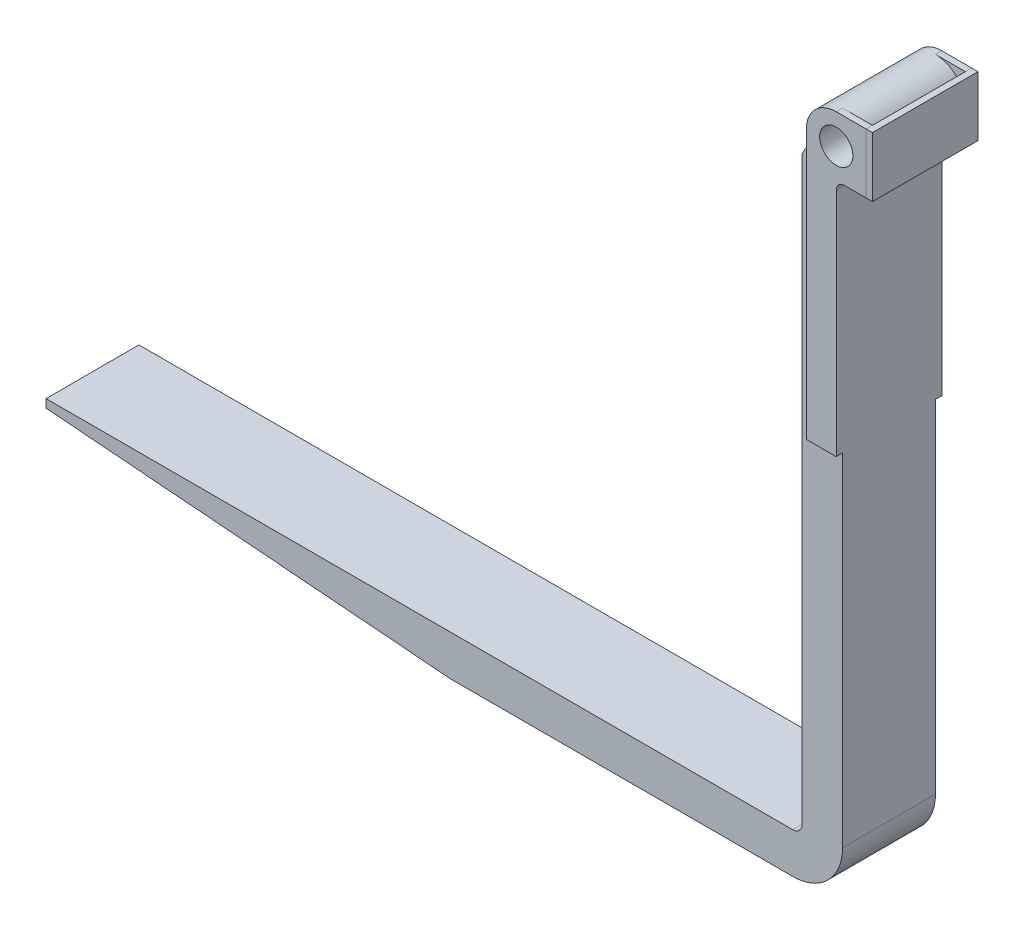
ISO-10303-21;
HEADER;
FILE_DESCRIPTION(('STEP AP214'),'2;1');
FILE_NAME('part.step','',(''),(''),'','','');
FILE_SCHEMA(('AUTOMOTIVE_DESIGN { 1 0 10303 214 1 1 1 1 }'));
ENDSEC;
DATA;
#1=APPLICATION_CONTEXT('core data for automotive mechanical design processes');
#2=APPLICATION_PROTOCOL_DEFINITION('international standard','automotive_design',2000,#1);
#3=PRODUCT_CONTEXT('',#1,'mechanical');
#4=PRODUCT('Part','Part','',(#3));
#5=PRODUCT_RELATED_PRODUCT_CATEGORY('part','',(#4));
#6=PRODUCT_DEFINITION_FORMATION('','',#4);
#7=PRODUCT_DEFINITION_CONTEXT('part definition',#1,'design');
#8=PRODUCT_DEFINITION('design','',#6,#7);
#9=PRODUCT_DEFINITION_SHAPE('','',#8);
#10=(LENGTH_UNIT() NAMED_UNIT(*) SI_UNIT(.MILLI.,.METRE.));
#11=(NAMED_UNIT(*) PLANE_ANGLE_UNIT() SI_UNIT($,.RADIAN.));
#12=(NAMED_UNIT(*) SI_UNIT($,.STERADIAN.) SOLID_ANGLE_UNIT());
#13=UNCERTAINTY_MEASURE_WITH_UNIT(LENGTH_MEASURE(1.E-05),#10,'distance_accuracy_value','');
#14=(GEOMETRIC_REPRESENTATION_CONTEXT(3) GLOBAL_UNCERTAINTY_ASSIGNED_CONTEXT((#13)) GLOBAL_UNIT_ASSIGNED_CONTEXT((#10,
#11,#12)) REPRESENTATION_CONTEXT('',''));
#15=CARTESIAN_POINT('',(0.,0.,0.));
#16=DIRECTION('',(0.,0.,1.));
#17=DIRECTION('',(1.,0.,0.));
#18=AXIS2_PLACEMENT_3D('',#15,#16,#17);
#19=CARTESIAN_POINT('',(54.5,1040.,79.5));
#20=DIRECTION('',(0.,0.,-1.));
#21=DIRECTION('',(-1.,0.,0.));
#22=AXIS2_PLACEMENT_3D('',#19,#20,#21);
#23=PLANE('',#22);
#24=DIRECTION('',(0.,-1.,0.));
#25=VECTOR('',#24,1.);
#26=CARTESIAN_POINT('',(45.,1040.,79.5));
#27=LINE('',#26,#25);
#28=CARTESIAN_POINT('',(45.,1040.,79.5));
#29=VERTEX_POINT('',#28);
#30=CARTESIAN_POINT('',(45.,950.,79.5));
#31=VERTEX_POINT('',#30);
#32=EDGE_CURVE('E106',#29,#31,#27,.T.);
#33=ORIENTED_EDGE('',*,*,#32,.T.);
#34=DIRECTION('',(-1.,0.,0.));
#35=VECTOR('',#34,1.);
#36=CARTESIAN_POINT('',(54.5,950.,79.5));
#37=LINE('',#36,#35);
#38=CARTESIAN_POINT('',(54.5,950.,79.5));
#39=VERTEX_POINT('',#38);
#40=EDGE_CURVE('E12',#39,#31,#37,.T.);
#41=ORIENTED_EDGE('',*,*,#40,.F.);
#42=DIRECTION('',(0.,-1.,0.));
#43=VECTOR('',#42,1.);
#44=CARTESIAN_POINT('',(54.5,1040.,79.5));
#45=LINE('',#44,#43);
#46=CARTESIAN_POINT('',(54.5,1040.,79.5));
#47=VERTEX_POINT('',#46);
#48=EDGE_CURVE('E94',#47,#39,#45,.T.);
#49=ORIENTED_EDGE('',*,*,#48,.F.);
#50=DIRECTION('',(-1.,0.,0.));
#51=VECTOR('',#50,1.);
#52=CARTESIAN_POINT('',(54.5,1040.,79.5));
#53=LINE('',#52,#51);
#54=EDGE_CURVE('E102',#47,#29,#53,.T.);
#55=ORIENTED_EDGE('',*,*,#54,.T.);
#56=EDGE_LOOP('',(#33,#41,#49,#55));
#57=FACE_BOUND('',#56,.T.);
#58=ADVANCED_FACE('F43',(#57),#23,.F.);
#59=CARTESIAN_POINT('',(54.5,950.,79.5));
#60=DIRECTION('',(0.,1.,0.));
#61=DIRECTION('',(0.,0.,1.));
#62=AXIS2_PLACEMENT_3D('',#59,#60,#61);
#63=PLANE('',#62);
#64=DIRECTION('',(0.,0.,-1.));
#65=VECTOR('',#64,1.);
#66=CARTESIAN_POINT('',(45.,950.,79.5));
#67=LINE('',#66,#65);
#68=CARTESIAN_POINT('',(45.,950.,-79.5));
#69=VERTEX_POINT('',#68);
#70=EDGE_CURVE('E98',#31,#69,#67,.T.);
#71=ORIENTED_EDGE('',*,*,#70,.T.);
#72=DIRECTION('',(-1.,0.,0.));
#73=VECTOR('',#72,1.);
#74=CARTESIAN_POINT('',(54.5,950.,-79.5));
#75=LINE('',#74,#73);
#76=CARTESIAN_POINT('',(54.5,950.,-79.5));
#77=VERTEX_POINT('',#76);
#78=EDGE_CURVE('E51',#77,#69,#75,.T.);
#79=ORIENTED_EDGE('',*,*,#78,.F.);
#80=DIRECTION('',(0.,0.,-1.));
#81=VECTOR('',#80,1.);
#82=CARTESIAN_POINT('',(54.5,950.,79.5));
#83=LINE('',#82,#81);
#84=EDGE_CURVE('E89',#39,#77,#83,.T.);
#85=ORIENTED_EDGE('',*,*,#84,.F.);
#86=ORIENTED_EDGE('',*,*,#40,.T.);
#87=EDGE_LOOP('',(#71,#79,#85,#86));
#88=FACE_BOUND('',#87,.T.);
#89=ADVANCED_FACE('F97',(#88),#63,.F.);
#90=CARTESIAN_POINT('',(54.5,1040.,-79.5));
#91=DIRECTION('',(0.,0.,1.));
#92=DIRECTION('',(1.,0.,0.));
#93=AXIS2_PLACEMENT_3D('',#90,#91,#92);
#94=PLANE('',#93);
#95=DIRECTION('',(0.,1.,0.));
#96=VECTOR('',#95,1.);
#97=CARTESIAN_POINT('',(45.,1040.,-79.5));
#98=LINE('',#97,#96);
#99=CARTESIAN_POINT('',(45.,1040.,-79.5));
#100=VERTEX_POINT('',#99);
#101=EDGE_CURVE('E76',#69,#100,#98,.T.);
#102=ORIENTED_EDGE('',*,*,#101,.T.);
#103=DIRECTION('',(-1.,0.,0.));
#104=VECTOR('',#103,1.);
#105=CARTESIAN_POINT('',(54.5,1040.,-79.5));
#106=LINE('',#105,#104);
#107=CARTESIAN_POINT('',(54.5,1040.,-79.5));
#108=VERTEX_POINT('',#107);
#109=EDGE_CURVE('E99',#108,#100,#106,.T.);
#110=ORIENTED_EDGE('',*,*,#109,.F.);
#111=DIRECTION('',(0.,1.,0.));
#112=VECTOR('',#111,1.);
#113=CARTESIAN_POINT('',(54.5,1040.,-79.5));
#114=LINE('',#113,#112);
#115=EDGE_CURVE('E92',#77,#108,#114,.T.);
#116=ORIENTED_EDGE('',*,*,#115,.F.);
#117=ORIENTED_EDGE('',*,*,#78,.T.);
#118=EDGE_LOOP('',(#102,#110,#116,#117));
#119=FACE_BOUND('',#118,.T.);
#120=ADVANCED_FACE('F100',(#119),#94,.F.);
#121=CARTESIAN_POINT('',(54.5,1040.,79.5));
#122=DIRECTION('',(0.,-1.,0.));
#123=DIRECTION('',(0.,0.,-1.));
#124=AXIS2_PLACEMENT_3D('',#121,#122,#123);
#125=PLANE('',#124);
#126=DIRECTION('',(0.,0.,1.));
#127=VECTOR('',#126,1.);
#128=CARTESIAN_POINT('',(45.,1040.,79.5));
#129=LINE('',#128,#127);
#130=EDGE_CURVE('E82',#100,#29,#129,.T.);
#131=ORIENTED_EDGE('',*,*,#130,.T.);
#132=ORIENTED_EDGE('',*,*,#54,.F.);
#133=DIRECTION('',(0.,0.,1.));
#134=VECTOR('',#133,1.);
#135=CARTESIAN_POINT('',(54.5,1040.,79.5));
#136=LINE('',#135,#134);
#137=EDGE_CURVE('E59',#108,#47,#136,.T.);
#138=ORIENTED_EDGE('',*,*,#137,.F.);
#139=ORIENTED_EDGE('',*,*,#109,.T.);
#140=EDGE_LOOP('',(#131,#132,#138,#139));
#141=FACE_BOUND('',#140,.T.);
#142=ADVANCED_FACE('F113',(#141),#125,.F.);
#143=CARTESIAN_POINT('',(54.5,0.,0.));
#144=DIRECTION('',(1.,0.,0.));
#145=DIRECTION('',(0.,0.,-1.));
#146=AXIS2_PLACEMENT_3D('',#143,#144,#145);
#147=PLANE('',#146);
#148=ORIENTED_EDGE('',*,*,#48,.T.);
#149=ORIENTED_EDGE('',*,*,#84,.T.);
#150=ORIENTED_EDGE('',*,*,#115,.T.);
#151=ORIENTED_EDGE('',*,*,#137,.T.);
#152=EDGE_LOOP('',(#148,#149,#150,#151));
#153=FACE_BOUND('',#152,.T.);
#154=ADVANCED_FACE('F90',(#153),#147,.T.);
#155=CARTESIAN_POINT('',(45.,0.,0.));
#156=DIRECTION('',(1.,0.,0.));
#157=DIRECTION('',(0.,0.,-1.));
#158=AXIS2_PLACEMENT_3D('',#155,#156,#157);
#159=PLANE('',#158);
#160=ORIENTED_EDGE('',*,*,#32,.F.);
#161=ORIENTED_EDGE('',*,*,#130,.F.);
#162=ORIENTED_EDGE('',*,*,#101,.F.);
#163=ORIENTED_EDGE('',*,*,#70,.F.);
#164=EDGE_LOOP('',(#160,#161,#162,#163));
#165=FACE_BOUND('',#164,.T.);
#166=ADVANCED_FACE('F116',(#165),#159,.F.);
#167=CLOSED_SHELL('',(#58,#89,#120,#142,#154,#166));
#168=MANIFOLD_SOLID_BREP('B2',#167);
#169=CARTESIAN_POINT('',(-75.,75.,-70.));
#170=DIRECTION('',(0.,0.,-1.));
#171=DIRECTION('',(-1.,0.,0.));
#172=AXIS2_PLACEMENT_3D('',#169,#170,#171);
#173=PLANE('',#172);
#174=DIRECTION('',(-0.489295003783335,-0.87211834017676,0.));
#175=VECTOR('',#174,1.);
#176=CARTESIAN_POINT('',(-61.,950.,-70.));
#177=LINE('',#176,#175);
#178=CARTESIAN_POINT('',(-45.,978.518364861553,-70.));
#179=VERTEX_POINT('',#178);
#180=CARTESIAN_POINT('',(-61.,950.,-70.));
#181=VERTEX_POINT('',#180);
#182=EDGE_CURVE('E433',#179,#181,#177,.T.);
#183=ORIENTED_EDGE('',*,*,#182,.F.);
#184=DIRECTION('',(0.,-1.,0.));
#185=VECTOR('',#184,1.);
#186=CARTESIAN_POINT('',(-45.0000000000001,0.,-70.));
#187=LINE('',#186,#185);
#188=CARTESIAN_POINT('',(-45.0000000000001,590.,-70.));
#189=VERTEX_POINT('',#188);
#190=EDGE_CURVE('E41',#179,#189,#187,.T.);
#191=ORIENTED_EDGE('',*,*,#190,.T.);
#192=DIRECTION('',(1.,0.,0.));
#193=VECTOR('',#192,1.);
#194=CARTESIAN_POINT('',(1.45562574339743E-12,590.,-70.));
#195=LINE('',#194,#193);
#196=CARTESIAN_POINT('',(0.,590.,-70.));
#197=VERTEX_POINT('',#196);
#198=EDGE_CURVE('E413',#189,#197,#195,.T.);
#199=ORIENTED_EDGE('',*,*,#198,.T.);
#200=DIRECTION('',(0.,-1.,0.));
#201=VECTOR('',#200,1.);
#202=CARTESIAN_POINT('',(0.,950.,-70.));
#203=LINE('',#202,#201);
#204=CARTESIAN_POINT('',(0.,75.0000000000005,-70.));
#205=VERTEX_POINT('',#204);
#206=EDGE_CURVE('E547',#197,#205,#203,.T.);
#207=ORIENTED_EDGE('',*,*,#206,.T.);
#208=CARTESIAN_POINT('',(-75.,75.,-70.));
#209=DIRECTION('',(0.,0.,-1.));
#210=DIRECTION('',(-1.,0.,0.));
#211=AXIS2_PLACEMENT_3D('',#208,#209,#210);
#212=CIRCLE('',#211,75.);
#213=CARTESIAN_POINT('',(-75.0000000000005,0.,-70.));
#214=VERTEX_POINT('',#213);
#215=EDGE_CURVE('E544',#205,#214,#212,.T.);
#216=ORIENTED_EDGE('',*,*,#215,.T.);
#217=DIRECTION('',(-1.,0.,0.));
#218=VECTOR('',#217,1.);
#219=CARTESIAN_POINT('',(-75.0000000000005,0.,-70.));
#220=LINE('',#219,#218);
#221=CARTESIAN_POINT('',(-590.,0.,-69.9999999999998));
#222=VERTEX_POINT('',#221);
#223=EDGE_CURVE('E542',#214,#222,#220,.T.);
#224=ORIENTED_EDGE('',*,*,#223,.T.);
#225=DIRECTION('',(0.996854130580606,-0.0792580743166547,0.));
#226=VECTOR('',#225,1.);
#227=CARTESIAN_POINT('',(-84.1608042146896,-40.2183622878485,-70.));
#228=LINE('',#227,#226);
#229=CARTESIAN_POINT('',(-1200.,48.5,-70.));
#230=VERTEX_POINT('',#229);
#231=EDGE_CURVE('E171',#230,#222,#228,.T.);
#232=ORIENTED_EDGE('',*,*,#231,.F.);
#233=DIRECTION('',(0.,1.,0.));
#234=VECTOR('',#233,1.);
#235=CARTESIAN_POINT('',(-1200.,-1.46957615897682E-13,-70.));
#236=LINE('',#235,#234);
#237=CARTESIAN_POINT('',(-1200.,60.9999999999998,-70.));
#238=VERTEX_POINT('',#237);
#239=EDGE_CURVE('E540',#230,#238,#236,.T.);
#240=ORIENTED_EDGE('',*,*,#239,.T.);
#241=DIRECTION('',(-1.,0.,0.));
#242=VECTOR('',#241,1.);
#243=CARTESIAN_POINT('',(-75.0000000000005,61.,-70.));
#244=LINE('',#243,#242);
#245=CARTESIAN_POINT('',(-75.0000000000005,61.,-70.));
#246=VERTEX_POINT('',#245);
#247=EDGE_CURVE('E517',#246,#238,#244,.T.);
#248=ORIENTED_EDGE('',*,*,#247,.F.);
#249=CARTESIAN_POINT('',(-75.,75.,-70.));
#250=DIRECTION('',(0.,0.,1.));
#251=DIRECTION('',(1.,0.,0.));
#252=AXIS2_PLACEMENT_3D('',#249,#250,#251);
#253=CIRCLE('',#252,14.);
#254=CARTESIAN_POINT('',(-61.,75.0000000000001,-70.));
#255=VERTEX_POINT('',#254);
#256=EDGE_CURVE('E522',#255,#246,#253,.F.);
#257=ORIENTED_EDGE('',*,*,#256,.F.);
#258=DIRECTION('',(0.,1.,0.));
#259=VECTOR('',#258,1.);
#260=CARTESIAN_POINT('',(-61.,950.,-70.));
#261=LINE('',#260,#259);
#262=EDGE_CURVE('E550',#181,#255,#261,.F.);
#263=ORIENTED_EDGE('',*,*,#262,.F.);
#264=EDGE_LOOP('',(#183,#191,#199,#207,#216,#224,#232,#240,#248,#257,#263));
#265=FACE_BOUND('',#264,.T.);
#266=ADVANCED_FACE('F167',(#265),#173,.T.);
#267=CARTESIAN_POINT('',(0.,0.,70.));
#268=DIRECTION('',(0.,0.,1.));
#269=DIRECTION('',(1.,0.,0.));
#270=AXIS2_PLACEMENT_3D('',#267,#268,#269);
#271=PLANE('',#270);
#272=CARTESIAN_POINT('',(0.,995.,70.));
#273=DIRECTION('',(0.,0.,1.));
#274=DIRECTION('',(1.,0.,0.));
#275=AXIS2_PLACEMENT_3D('',#272,#273,#274);
#276=CIRCLE('',#275,45.);
#277=CARTESIAN_POINT('',(-45.,995.,70.));
#278=VERTEX_POINT('',#277);
#279=CARTESIAN_POINT('',(-43.0691824984959,981.959849735863,70.));
#280=VERTEX_POINT('',#279);
#281=EDGE_CURVE('E434',#278,#280,#276,.T.);
#282=ORIENTED_EDGE('',*,*,#281,.T.);
#283=DIRECTION('',(-0.489295003783335,-0.87211834017676,0.));
#284=VECTOR('',#283,1.);
#285=CARTESIAN_POINT('',(-61.,950.,70.));
#286=LINE('',#285,#284);
#287=CARTESIAN_POINT('',(-45.,978.518364861553,70.));
#288=VERTEX_POINT('',#287);
#289=EDGE_CURVE('E439',#280,#288,#286,.T.);
#290=ORIENTED_EDGE('',*,*,#289,.T.);
#291=DIRECTION('',(0.,-1.,0.));
#292=VECTOR('',#291,1.);
#293=CARTESIAN_POINT('',(-45.0000000000001,0.,70.));
#294=LINE('',#293,#292);
#295=EDGE_CURVE('E478',#278,#288,#294,.T.);
#296=ORIENTED_EDGE('',*,*,#295,.F.);
#297=EDGE_LOOP('',(#282,#290,#296));
#298=FACE_BOUND('',#297,.T.);
#299=ADVANCED_FACE('F599',(#298),#271,.F.);
#300=CARTESIAN_POINT('',(0.,950.,70.));
#301=VERTEX_POINT('',#300);
#302=CARTESIAN_POINT('',(45.,995.,70.));
#303=VERTEX_POINT('',#302);
#304=EDGE_CURVE('E193',#301,#303,#276,.T.);
#305=ORIENTED_EDGE('',*,*,#304,.T.);
#306=DIRECTION('',(0.,1.,0.));
#307=VECTOR('',#306,1.);
#308=CARTESIAN_POINT('',(45.,0.,70.));
#309=LINE('',#308,#307);
#310=CARTESIAN_POINT('',(45.,950.,70.));
#311=VERTEX_POINT('',#310);
#312=EDGE_CURVE('E472',#311,#303,#309,.T.);
#313=ORIENTED_EDGE('',*,*,#312,.F.);
#314=DIRECTION('',(1.,0.,0.));
#315=VECTOR('',#314,1.);
#316=CARTESIAN_POINT('',(0.,950.,70.));
#317=LINE('',#316,#315);
#318=CARTESIAN_POINT('',(12.5000000000001,950.,70.));
#319=VERTEX_POINT('',#318);
#320=EDGE_CURVE('E454',#319,#311,#317,.T.);
#321=ORIENTED_EDGE('',*,*,#320,.F.);
#322=CARTESIAN_POINT('',(12.5,937.5,70.));
#323=DIRECTION('',(0.,0.,1.));
#324=DIRECTION('',(1.,0.,0.));
#325=AXIS2_PLACEMENT_3D('',#322,#323,#324);
#326=CIRCLE('',#325,12.5);
#327=CARTESIAN_POINT('',(0.,937.5,70.));
#328=VERTEX_POINT('',#327);
#329=EDGE_CURVE('E484',#328,#319,#326,.F.);
#330=ORIENTED_EDGE('',*,*,#329,.F.);
#331=DIRECTION('',(0.,-1.,0.));
#332=VECTOR('',#331,1.);
#333=CARTESIAN_POINT('',(0.,950.,70.));
#334=LINE('',#333,#332);
#335=EDGE_CURVE('E531',#301,#328,#334,.T.);
#336=ORIENTED_EDGE('',*,*,#335,.F.);
#337=EDGE_LOOP('',(#305,#313,#321,#330,#336));
#338=FACE_BOUND('',#337,.T.);
#339=ADVANCED_FACE('F658',(#338),#271,.F.);
#340=CARTESIAN_POINT('',(0.,1040.,70.));
#341=VERTEX_POINT('',#340);
#342=EDGE_CURVE('E431',#303,#341,#276,.T.);
#343=ORIENTED_EDGE('',*,*,#342,.T.);
#344=DIRECTION('',(-1.,0.,0.));
#345=VECTOR('',#344,1.);
#346=CARTESIAN_POINT('',(0.,1040.,70.));
#347=LINE('',#346,#345);
#348=CARTESIAN_POINT('',(45.,1040.,70.));
#349=VERTEX_POINT('',#348);
#350=EDGE_CURVE('E475',#349,#341,#347,.T.);
#351=ORIENTED_EDGE('',*,*,#350,.F.);
#352=EDGE_CURVE('E449',#303,#349,#309,.T.);
#353=ORIENTED_EDGE('',*,*,#352,.F.);
#354=EDGE_LOOP('',(#343,#351,#353));
#355=FACE_BOUND('',#354,.T.);
#356=ADVANCED_FACE('F657',(#355),#271,.F.);
#357=CARTESIAN_POINT('',(-75.,75.,70.));
#358=DIRECTION('',(0.,0.,-1.));
#359=DIRECTION('',(-1.,0.,0.));
#360=AXIS2_PLACEMENT_3D('',#357,#358,#359);
#361=PLANE('',#360);
#362=DIRECTION('',(1.,0.,0.));
#363=VECTOR('',#362,1.);
#364=CARTESIAN_POINT('',(1.45562574339743E-12,590.,70.));
#365=LINE('',#364,#363);
#366=CARTESIAN_POINT('',(-45.0000000000001,590.,70.));
#367=VERTEX_POINT('',#366);
#368=CARTESIAN_POINT('',(0.,590.,70.));
#369=VERTEX_POINT('',#368);
#370=EDGE_CURVE('E481',#367,#369,#365,.T.);
#371=ORIENTED_EDGE('',*,*,#370,.F.);
#372=EDGE_CURVE('E176',#288,#367,#294,.T.);
#373=ORIENTED_EDGE('',*,*,#372,.F.);
#374=CARTESIAN_POINT('',(-61.,950.,70.));
#375=VERTEX_POINT('',#374);
#376=EDGE_CURVE('E443',#288,#375,#286,.T.);
#377=ORIENTED_EDGE('',*,*,#376,.T.);
#378=DIRECTION('',(0.,1.,0.));
#379=VECTOR('',#378,1.);
#380=CARTESIAN_POINT('',(-61.,950.,70.));
#381=LINE('',#380,#379);
#382=CARTESIAN_POINT('',(-61.,75.0000000000001,70.));
#383=VERTEX_POINT('',#382);
#384=EDGE_CURVE('E533',#375,#383,#381,.F.);
#385=ORIENTED_EDGE('',*,*,#384,.T.);
#386=CARTESIAN_POINT('',(-75.,75.,70.));
#387=DIRECTION('',(0.,0.,1.));
#388=DIRECTION('',(1.,0.,0.));
#389=AXIS2_PLACEMENT_3D('',#386,#387,#388);
#390=CIRCLE('',#389,14.);
#391=CARTESIAN_POINT('',(-75.0000000000005,61.,70.));
#392=VERTEX_POINT('',#391);
#393=EDGE_CURVE('E535',#383,#392,#390,.F.);
#394=ORIENTED_EDGE('',*,*,#393,.T.);
#395=DIRECTION('',(-1.,0.,0.));
#396=VECTOR('',#395,1.);
#397=CARTESIAN_POINT('',(-75.0000000000005,61.,70.));
#398=LINE('',#397,#396);
#399=CARTESIAN_POINT('',(-1200.,60.9999999999998,70.));
#400=VERTEX_POINT('',#399);
#401=EDGE_CURVE('E518',#392,#400,#398,.T.);
#402=ORIENTED_EDGE('',*,*,#401,.T.);
#403=DIRECTION('',(0.,1.,0.));
#404=VECTOR('',#403,1.);
#405=CARTESIAN_POINT('',(-1200.,-1.46957615897682E-13,70.));
#406=LINE('',#405,#404);
#407=CARTESIAN_POINT('',(-1200.,48.5,70.));
#408=VERTEX_POINT('',#407);
#409=EDGE_CURVE('E521',#408,#400,#406,.T.);
#410=ORIENTED_EDGE('',*,*,#409,.F.);
#411=DIRECTION('',(0.996854130580606,-0.0792580743166547,0.));
#412=VECTOR('',#411,1.);
#413=CARTESIAN_POINT('',(-84.1608042146896,-40.2183622878485,70.));
#414=LINE('',#413,#412);
#415=CARTESIAN_POINT('',(-589.999999999999,0.,70.));
#416=VERTEX_POINT('',#415);
#417=EDGE_CURVE('E513',#408,#416,#414,.T.);
#418=ORIENTED_EDGE('',*,*,#417,.T.);
#419=DIRECTION('',(-1.,0.,0.));
#420=VECTOR('',#419,1.);
#421=CARTESIAN_POINT('',(-75.0000000000005,0.,70.));
#422=LINE('',#421,#420);
#423=CARTESIAN_POINT('',(-75.0000000000005,0.,70.));
#424=VERTEX_POINT('',#423);
#425=EDGE_CURVE('E524',#424,#416,#422,.T.);
#426=ORIENTED_EDGE('',*,*,#425,.F.);
#427=CARTESIAN_POINT('',(-75.,75.,70.));
#428=DIRECTION('',(0.,0.,-1.));
#429=DIRECTION('',(-1.,0.,0.));
#430=AXIS2_PLACEMENT_3D('',#427,#428,#429);
#431=CIRCLE('',#430,75.);
#432=CARTESIAN_POINT('',(0.,75.0000000000005,70.));
#433=VERTEX_POINT('',#432);
#434=EDGE_CURVE('E527',#433,#424,#431,.T.);
#435=ORIENTED_EDGE('',*,*,#434,.F.);
#436=EDGE_CURVE('E530',#369,#433,#334,.T.);
#437=ORIENTED_EDGE('',*,*,#436,.F.);
#438=EDGE_LOOP('',(#371,#373,#377,#385,#394,#402,#410,#418,#426,#435,#437));
#439=FACE_BOUND('',#438,.T.);
#440=ADVANCED_FACE('F607',(#439),#361,.F.);
#441=CARTESIAN_POINT('',(-75.0000000000005,0.,70.));
#442=DIRECTION('',(0.,-1.,0.));
#443=DIRECTION('',(1.,0.,0.));
#444=AXIS2_PLACEMENT_3D('',#441,#442,#443);
#445=PLANE('',#444);
#446=ORIENTED_EDGE('',*,*,#425,.T.);
#447=DIRECTION('',(0.,0.,-1.));
#448=VECTOR('',#447,1.);
#449=CARTESIAN_POINT('',(-590.,0.,2166.14061172003));
#450=LINE('',#449,#448);
#451=EDGE_CURVE('E510',#416,#222,#450,.T.);
#452=ORIENTED_EDGE('',*,*,#451,.T.);
#453=ORIENTED_EDGE('',*,*,#223,.F.);
#454=DIRECTION('',(0.,0.,-1.));
#455=VECTOR('',#454,1.);
#456=CARTESIAN_POINT('',(-75.0000000000005,0.,70.));
#457=LINE('',#456,#455);
#458=EDGE_CURVE('E567',#424,#214,#457,.T.);
#459=ORIENTED_EDGE('',*,*,#458,.F.);
#460=EDGE_LOOP('',(#446,#452,#453,#459));
#461=FACE_BOUND('',#460,.T.);
#462=ADVANCED_FACE('F626',(#461),#445,.T.);
#463=CARTESIAN_POINT('',(-75.0000000000005,61.,70.));
#464=DIRECTION('',(0.,-1.,0.));
#465=DIRECTION('',(1.,0.,0.));
#466=AXIS2_PLACEMENT_3D('',#463,#464,#465);
#467=PLANE('',#466);
#468=ORIENTED_EDGE('',*,*,#247,.T.);
#469=DIRECTION('',(0.,0.,-1.));
#470=VECTOR('',#469,1.);
#471=CARTESIAN_POINT('',(-1200.,60.9999999999998,70.));
#472=LINE('',#471,#470);
#473=EDGE_CURVE('E568',#400,#238,#472,.T.);
#474=ORIENTED_EDGE('',*,*,#473,.F.);
#475=ORIENTED_EDGE('',*,*,#401,.F.);
#476=DIRECTION('',(0.,0.,-1.));
#477=VECTOR('',#476,1.);
#478=CARTESIAN_POINT('',(-75.0000000000005,61.,70.));
#479=LINE('',#478,#477);
#480=EDGE_CURVE('E537',#392,#246,#479,.T.);
#481=ORIENTED_EDGE('',*,*,#480,.T.);
#482=EDGE_LOOP('',(#468,#474,#475,#481));
#483=FACE_BOUND('',#482,.T.);
#484=ADVANCED_FACE('F169',(#483),#467,.F.);
#485=CARTESIAN_POINT('',(-1200.,-1.46957615897682E-13,70.));
#486=DIRECTION('',(-1.,0.,0.));
#487=DIRECTION('',(0.,-1.,0.));
#488=AXIS2_PLACEMENT_3D('',#485,#486,#487);
#489=PLANE('',#488);
#490=DIRECTION('',(0.,0.,-1.));
#491=VECTOR('',#490,1.);
#492=CARTESIAN_POINT('',(-1200.,48.5,2166.14061172003));
#493=LINE('',#492,#491);
#494=EDGE_CURVE('E509',#408,#230,#493,.T.);
#495=ORIENTED_EDGE('',*,*,#494,.F.);
#496=ORIENTED_EDGE('',*,*,#409,.T.);
#497=ORIENTED_EDGE('',*,*,#473,.T.);
#498=ORIENTED_EDGE('',*,*,#239,.F.);
#499=EDGE_LOOP('',(#495,#496,#497,#498));
#500=FACE_BOUND('',#499,.T.);
#501=ADVANCED_FACE('F706',(#500),#489,.T.);
#502=CARTESIAN_POINT('',(-75.,75.,70.));
#503=DIRECTION('',(0.,0.,-1.));
#504=DIRECTION('',(-1.,0.,0.));
#505=AXIS2_PLACEMENT_3D('',#502,#503,#504);
#506=CYLINDRICAL_SURFACE('',#505,75.);
#507=ORIENTED_EDGE('',*,*,#215,.F.);
#508=DIRECTION('',(0.,0.,-1.));
#509=VECTOR('',#508,1.);
#510=CARTESIAN_POINT('',(0.,75.0000000000005,70.));
#511=LINE('',#510,#509);
#512=EDGE_CURVE('E564',#433,#205,#511,.T.);
#513=ORIENTED_EDGE('',*,*,#512,.F.);
#514=ORIENTED_EDGE('',*,*,#434,.T.);
#515=ORIENTED_EDGE('',*,*,#458,.T.);
#516=EDGE_LOOP('',(#507,#513,#514,#515));
#517=FACE_BOUND('',#516,.T.);
#518=ADVANCED_FACE('F631',(#517),#506,.T.);
#519=CARTESIAN_POINT('',(0.,950.,70.));
#520=DIRECTION('',(1.,0.,0.));
#521=DIRECTION('',(0.,0.,-1.));
#522=AXIS2_PLACEMENT_3D('',#519,#520,#521);
#523=PLANE('',#522);
#524=CARTESIAN_POINT('',(0.,950.,-70.));
#525=VERTEX_POINT('',#524);
#526=CARTESIAN_POINT('',(0.,937.5,-70.));
#527=VERTEX_POINT('',#526);
#528=EDGE_CURVE('E548',#525,#527,#203,.T.);
#529=ORIENTED_EDGE('',*,*,#528,.F.);
#530=DIRECTION('',(0.,0.,-1.));
#531=VECTOR('',#530,1.);
#532=CARTESIAN_POINT('',(0.,950.,70.));
#533=LINE('',#532,#531);
#534=EDGE_CURVE('E561',#301,#525,#533,.T.);
#535=ORIENTED_EDGE('',*,*,#534,.F.);
#536=ORIENTED_EDGE('',*,*,#335,.T.);
#537=DIRECTION('',(0.,0.,-1.));
#538=VECTOR('',#537,1.);
#539=CARTESIAN_POINT('',(0.,937.5,79.5));
#540=LINE('',#539,#538);
#541=CARTESIAN_POINT('',(0.,937.5,79.5));
#542=VERTEX_POINT('',#541);
#543=EDGE_CURVE('E492',#542,#328,#540,.T.);
#544=ORIENTED_EDGE('',*,*,#543,.F.);
#545=DIRECTION('',(0.,1.,0.));
#546=VECTOR('',#545,1.);
#547=CARTESIAN_POINT('',(0.,0.,79.5));
#548=LINE('',#547,#546);
#549=CARTESIAN_POINT('',(0.,590.,79.5));
#550=VERTEX_POINT('',#549);
#551=EDGE_CURVE('E462',#550,#542,#548,.T.);
#552=ORIENTED_EDGE('',*,*,#551,.F.);
#553=DIRECTION('',(0.,0.,-1.));
#554=VECTOR('',#553,1.);
#555=CARTESIAN_POINT('',(0.,590.,79.5));
#556=LINE('',#555,#554);
#557=EDGE_CURVE('E495',#550,#369,#556,.T.);
#558=ORIENTED_EDGE('',*,*,#557,.T.);
#559=ORIENTED_EDGE('',*,*,#436,.T.);
#560=ORIENTED_EDGE('',*,*,#512,.T.);
#561=ORIENTED_EDGE('',*,*,#206,.F.);
#562=DIRECTION('',(0.,0.,1.));
#563=VECTOR('',#562,1.);
#564=CARTESIAN_POINT('',(0.,590.,-79.5));
#565=LINE('',#564,#563);
#566=CARTESIAN_POINT('',(0.,590.,-79.5));
#567=VERTEX_POINT('',#566);
#568=EDGE_CURVE('E185',#567,#197,#565,.T.);
#569=ORIENTED_EDGE('',*,*,#568,.F.);
#570=DIRECTION('',(0.,1.,0.));
#571=VECTOR('',#570,1.);
#572=CARTESIAN_POINT('',(0.,0.,-79.5));
#573=LINE('',#572,#571);
#574=CARTESIAN_POINT('',(0.,937.5,-79.5));
#575=VERTEX_POINT('',#574);
#576=EDGE_CURVE('E388',#567,#575,#573,.T.);
#577=ORIENTED_EDGE('',*,*,#576,.T.);
#578=DIRECTION('',(0.,0.,1.));
#579=VECTOR('',#578,1.);
#580=CARTESIAN_POINT('',(0.,937.5,-79.5));
#581=LINE('',#580,#579);
#582=EDGE_CURVE('E427',#575,#527,#581,.T.);
#583=ORIENTED_EDGE('',*,*,#582,.T.);
#584=EDGE_LOOP('',(#529,#535,#536,#544,#552,#558,#559,#560,#561,#569,#577,#583));
#585=FACE_BOUND('',#584,.T.);
#586=ADVANCED_FACE('F635',(#585),#523,.T.);
#587=CARTESIAN_POINT('',(-61.,950.,70.));
#588=DIRECTION('',(1.,0.,0.));
#589=DIRECTION('',(0.,0.,-1.));
#590=AXIS2_PLACEMENT_3D('',#587,#588,#589);
#591=PLANE('',#590);
#592=ORIENTED_EDGE('',*,*,#262,.T.);
#593=DIRECTION('',(0.,0.,-1.));
#594=VECTOR('',#593,1.);
#595=CARTESIAN_POINT('',(-61.,75.0000000000001,70.));
#596=LINE('',#595,#594);
#597=EDGE_CURVE('E555',#383,#255,#596,.T.);
#598=ORIENTED_EDGE('',*,*,#597,.F.);
#599=ORIENTED_EDGE('',*,*,#384,.F.);
#600=DIRECTION('',(0.,0.,-1.));
#601=VECTOR('',#600,1.);
#602=CARTESIAN_POINT('',(-61.,950.,70.));
#603=LINE('',#602,#601);
#604=EDGE_CURVE('E558',#375,#181,#603,.T.);
#605=ORIENTED_EDGE('',*,*,#604,.T.);
#606=EDGE_LOOP('',(#592,#598,#599,#605));
#607=FACE_BOUND('',#606,.T.);
#608=ADVANCED_FACE('F612',(#607),#591,.F.);
#609=CARTESIAN_POINT('',(-75.,75.,70.));
#610=DIRECTION('',(0.,0.,-1.));
#611=DIRECTION('',(-1.,0.,0.));
#612=AXIS2_PLACEMENT_3D('',#609,#610,#611);
#613=CYLINDRICAL_SURFACE('',#612,14.);
#614=ORIENTED_EDGE('',*,*,#256,.T.);
#615=ORIENTED_EDGE('',*,*,#480,.F.);
#616=ORIENTED_EDGE('',*,*,#393,.F.);
#617=ORIENTED_EDGE('',*,*,#597,.T.);
#618=EDGE_LOOP('',(#614,#615,#616,#617));
#619=FACE_BOUND('',#618,.T.);
#620=ADVANCED_FACE('F616',(#619),#613,.F.);
#621=CARTESIAN_POINT('',(-1200.,48.5,2166.14061172003));
#622=DIRECTION('',(0.0792580743166547,0.996854130580606,0.));
#623=DIRECTION('',(-0.996854130580606,0.0792580743166547,0.));
#624=AXIS2_PLACEMENT_3D('',#621,#622,#623);
#625=PLANE('',#624);
#626=ORIENTED_EDGE('',*,*,#417,.F.);
#627=ORIENTED_EDGE('',*,*,#494,.T.);
#628=ORIENTED_EDGE('',*,*,#231,.T.);
#629=ORIENTED_EDGE('',*,*,#451,.F.);
#630=EDGE_LOOP('',(#626,#627,#628,#629));
#631=FACE_BOUND('',#630,.T.);
#632=ADVANCED_FACE('F623',(#631),#625,.F.);
#633=CARTESIAN_POINT('',(45.,0.,79.5));
#634=DIRECTION('',(-1.,0.,0.));
#635=DIRECTION('',(0.,0.,1.));
#636=AXIS2_PLACEMENT_3D('',#633,#634,#635);
#637=PLANE('',#636);
#638=ORIENTED_EDGE('',*,*,#312,.T.);
#639=ORIENTED_EDGE('',*,*,#352,.T.);
#640=DIRECTION('',(0.,0.,-1.));
#641=VECTOR('',#640,1.);
#642=CARTESIAN_POINT('',(45.,1040.,79.5));
#643=LINE('',#642,#641);
#644=CARTESIAN_POINT('',(45.,1040.,79.5));
#645=VERTEX_POINT('',#644);
#646=EDGE_CURVE('E506',#645,#349,#643,.T.);
#647=ORIENTED_EDGE('',*,*,#646,.F.);
#648=DIRECTION('',(0.,1.,0.));
#649=VECTOR('',#648,1.);
#650=CARTESIAN_POINT('',(45.,0.,79.5));
#651=LINE('',#650,#649);
#652=CARTESIAN_POINT('',(45.,950.,79.5));
#653=VERTEX_POINT('',#652);
#654=EDGE_CURVE('E450',#653,#645,#651,.T.);
#655=ORIENTED_EDGE('',*,*,#654,.F.);
#656=DIRECTION('',(0.,0.,-1.));
#657=VECTOR('',#656,1.);
#658=CARTESIAN_POINT('',(45.,950.,79.5));
#659=LINE('',#658,#657);
#660=EDGE_CURVE('E471',#653,#311,#659,.T.);
#661=ORIENTED_EDGE('',*,*,#660,.T.);
#662=EDGE_LOOP('',(#638,#639,#647,#655,#661));
#663=FACE_BOUND('',#662,.T.);
#664=ADVANCED_FACE('F650',(#663),#637,.F.);
#665=CARTESIAN_POINT('',(0.,1040.,79.5));
#666=DIRECTION('',(0.,-1.,0.));
#667=DIRECTION('',(0.,0.,-1.));
#668=AXIS2_PLACEMENT_3D('',#665,#666,#667);
#669=PLANE('',#668);
#670=ORIENTED_EDGE('',*,*,#350,.T.);
#671=DIRECTION('',(0.,0.,-1.));
#672=VECTOR('',#671,1.);
#673=CARTESIAN_POINT('',(0.,1040.,79.5));
#674=LINE('',#673,#672);
#675=CARTESIAN_POINT('',(0.,1040.,79.5));
#676=VERTEX_POINT('',#675);
#677=EDGE_CURVE('E503',#676,#341,#674,.T.);
#678=ORIENTED_EDGE('',*,*,#677,.F.);
#679=DIRECTION('',(-1.,0.,0.));
#680=VECTOR('',#679,1.);
#681=CARTESIAN_POINT('',(0.,1040.,79.5));
#682=LINE('',#681,#680);
#683=EDGE_CURVE('E453',#645,#676,#682,.T.);
#684=ORIENTED_EDGE('',*,*,#683,.F.);
#685=ORIENTED_EDGE('',*,*,#646,.T.);
#686=EDGE_LOOP('',(#670,#678,#684,#685));
#687=FACE_BOUND('',#686,.T.);
#688=ADVANCED_FACE('F653',(#687),#669,.F.);
#689=CARTESIAN_POINT('',(0.,995.,79.5));
#690=DIRECTION('',(0.,0.,-1.));
#691=DIRECTION('',(-1.,0.,0.));
#692=AXIS2_PLACEMENT_3D('',#689,#690,#691);
#693=CYLINDRICAL_SURFACE('',#692,45.);
#694=ORIENTED_EDGE('',*,*,#677,.T.);
#695=ORIENTED_EDGE('',*,*,#342,.F.);
#696=ORIENTED_EDGE('',*,*,#304,.F.);
#697=ORIENTED_EDGE('',*,*,#534,.T.);
#698=CARTESIAN_POINT('',(0.,995.,-70.));
#699=DIRECTION('',(0.,0.,1.));
#700=DIRECTION('',(1.,0.,0.));
#701=AXIS2_PLACEMENT_3D('',#698,#699,#700);
#702=CIRCLE('',#701,45.);
#703=CARTESIAN_POINT('',(45.,995.,-70.));
#704=VERTEX_POINT('',#703);
#705=EDGE_CURVE('E435',#525,#704,#702,.T.);
#706=ORIENTED_EDGE('',*,*,#705,.T.);
#707=CARTESIAN_POINT('',(0.,1040.,-70.));
#708=VERTEX_POINT('',#707);
#709=EDGE_CURVE('E438',#704,#708,#702,.T.);
#710=ORIENTED_EDGE('',*,*,#709,.T.);
#711=DIRECTION('',(0.,0.,1.));
#712=VECTOR('',#711,1.);
#713=CARTESIAN_POINT('',(0.,1040.,-79.5));
#714=LINE('',#713,#712);
#715=CARTESIAN_POINT('',(0.,1040.,-79.5));
#716=VERTEX_POINT('',#715);
#717=EDGE_CURVE('E419',#716,#708,#714,.T.);
#718=ORIENTED_EDGE('',*,*,#717,.F.);
#719=CARTESIAN_POINT('',(0.,995.,-79.5));
#720=DIRECTION('',(0.,0.,1.));
#721=DIRECTION('',(1.,0.,0.));
#722=AXIS2_PLACEMENT_3D('',#719,#720,#721);
#723=CIRCLE('',#722,45.);
#724=CARTESIAN_POINT('',(-45.,995.,-79.5));
#725=VERTEX_POINT('',#724);
#726=EDGE_CURVE('E398',#716,#725,#723,.T.);
#727=ORIENTED_EDGE('',*,*,#726,.T.);
#728=DIRECTION('',(0.,0.,1.));
#729=VECTOR('',#728,1.);
#730=CARTESIAN_POINT('',(-45.,995.,-79.5));
#731=LINE('',#730,#729);
#732=CARTESIAN_POINT('',(-45.,995.,-70.));
#733=VERTEX_POINT('',#732);
#734=EDGE_CURVE('E421',#725,#733,#731,.T.);
#735=ORIENTED_EDGE('',*,*,#734,.T.);
#736=CARTESIAN_POINT('',(-43.0691824984959,981.959849735863,-70.));
#737=VERTEX_POINT('',#736);
#738=EDGE_CURVE('E370',#733,#737,#702,.T.);
#739=ORIENTED_EDGE('',*,*,#738,.T.);
#740=DIRECTION('',(0.,0.,-1.));
#741=VECTOR('',#740,1.);
#742=CARTESIAN_POINT('',(-43.0691824984959,981.959849735863,70.));
#743=LINE('',#742,#741);
#744=EDGE_CURVE('E442',#280,#737,#743,.T.);
#745=ORIENTED_EDGE('',*,*,#744,.F.);
#746=ORIENTED_EDGE('',*,*,#281,.F.);
#747=DIRECTION('',(0.,0.,-1.));
#748=VECTOR('',#747,1.);
#749=CARTESIAN_POINT('',(-45.,995.,79.5));
#750=LINE('',#749,#748);
#751=CARTESIAN_POINT('',(-45.,995.,79.5));
#752=VERTEX_POINT('',#751);
#753=EDGE_CURVE('E501',#752,#278,#750,.T.);
#754=ORIENTED_EDGE('',*,*,#753,.F.);
#755=CARTESIAN_POINT('',(0.,995.,79.5));
#756=DIRECTION('',(0.,0.,1.));
#757=DIRECTION('',(1.,0.,0.));
#758=AXIS2_PLACEMENT_3D('',#755,#756,#757);
#759=CIRCLE('',#758,45.);
#760=EDGE_CURVE('E456',#676,#752,#759,.T.);
#761=ORIENTED_EDGE('',*,*,#760,.F.);
#762=EDGE_LOOP('',(#694,#695,#696,#697,#706,#710,#718,#727,#735,#739,#745,#746,#754,#761));
#763=FACE_BOUND('',#762,.T.);
#764=ADVANCED_FACE('F602',(#763),#693,.T.);
#765=CARTESIAN_POINT('',(-45.0000000000001,0.,79.5));
#766=DIRECTION('',(1.,0.,0.));
#767=DIRECTION('',(0.,1.,0.));
#768=AXIS2_PLACEMENT_3D('',#765,#766,#767);
#769=PLANE('',#768);
#770=ORIENTED_EDGE('',*,*,#295,.T.);
#771=ORIENTED_EDGE('',*,*,#372,.T.);
#772=DIRECTION('',(0.,0.,-1.));
#773=VECTOR('',#772,1.);
#774=CARTESIAN_POINT('',(-45.0000000000001,590.,79.5));
#775=LINE('',#774,#773);
#776=CARTESIAN_POINT('',(-45.0000000000001,590.,79.5));
#777=VERTEX_POINT('',#776);
#778=EDGE_CURVE('E498',#777,#367,#775,.T.);
#779=ORIENTED_EDGE('',*,*,#778,.F.);
#780=DIRECTION('',(0.,-1.,0.));
#781=VECTOR('',#780,1.);
#782=CARTESIAN_POINT('',(-45.0000000000001,0.,79.5));
#783=LINE('',#782,#781);
#784=EDGE_CURVE('E458',#752,#777,#783,.T.);
#785=ORIENTED_EDGE('',*,*,#784,.F.);
#786=ORIENTED_EDGE('',*,*,#753,.T.);
#787=EDGE_LOOP('',(#770,#771,#779,#785,#786));
#788=FACE_BOUND('',#787,.T.);
#789=ADVANCED_FACE('F579',(#788),#769,.F.);
#790=CARTESIAN_POINT('',(1.45562574339743E-12,590.,79.5));
#791=DIRECTION('',(0.,1.,0.));
#792=DIRECTION('',(-1.,0.,0.));
#793=AXIS2_PLACEMENT_3D('',#790,#791,#792);
#794=PLANE('',#793);
#795=ORIENTED_EDGE('',*,*,#370,.T.);
#796=ORIENTED_EDGE('',*,*,#557,.F.);
#797=DIRECTION('',(1.,0.,0.));
#798=VECTOR('',#797,1.);
#799=CARTESIAN_POINT('',(1.45562574339743E-12,590.,79.5));
#800=LINE('',#799,#798);
#801=EDGE_CURVE('E460',#777,#550,#800,.T.);
#802=ORIENTED_EDGE('',*,*,#801,.F.);
#803=ORIENTED_EDGE('',*,*,#778,.T.);
#804=EDGE_LOOP('',(#795,#796,#802,#803));
#805=FACE_BOUND('',#804,.T.);
#806=ADVANCED_FACE('F587',(#805),#794,.F.);
#807=CARTESIAN_POINT('',(12.5,937.5,79.5));
#808=DIRECTION('',(0.,0.,-1.));
#809=DIRECTION('',(-1.,0.,0.));
#810=AXIS2_PLACEMENT_3D('',#807,#808,#809);
#811=CYLINDRICAL_SURFACE('',#810,12.5);
#812=ORIENTED_EDGE('',*,*,#329,.T.);
#813=DIRECTION('',(0.,0.,-1.));
#814=VECTOR('',#813,1.);
#815=CARTESIAN_POINT('',(12.5000000000001,950.,79.5));
#816=LINE('',#815,#814);
#817=CARTESIAN_POINT('',(12.5000000000001,950.,79.5));
#818=VERTEX_POINT('',#817);
#819=EDGE_CURVE('E489',#818,#319,#816,.T.);
#820=ORIENTED_EDGE('',*,*,#819,.F.);
#821=CARTESIAN_POINT('',(12.5,937.5,79.5));
#822=DIRECTION('',(0.,0.,1.));
#823=DIRECTION('',(1.,0.,0.));
#824=AXIS2_PLACEMENT_3D('',#821,#822,#823);
#825=CIRCLE('',#824,12.5);
#826=EDGE_CURVE('E464',#542,#818,#825,.F.);
#827=ORIENTED_EDGE('',*,*,#826,.F.);
#828=ORIENTED_EDGE('',*,*,#543,.T.);
#829=EDGE_LOOP('',(#812,#820,#827,#828));
#830=FACE_BOUND('',#829,.T.);
#831=ADVANCED_FACE('F641',(#830),#811,.F.);
#832=CARTESIAN_POINT('',(0.,950.,79.5));
#833=DIRECTION('',(0.,1.,0.));
#834=DIRECTION('',(0.,0.,1.));
#835=AXIS2_PLACEMENT_3D('',#832,#833,#834);
#836=PLANE('',#835);
#837=ORIENTED_EDGE('',*,*,#320,.T.);
#838=ORIENTED_EDGE('',*,*,#660,.F.);
#839=DIRECTION('',(1.,0.,0.));
#840=VECTOR('',#839,1.);
#841=CARTESIAN_POINT('',(0.,950.,79.5));
#842=LINE('',#841,#840);
#843=EDGE_CURVE('E466',#818,#653,#842,.T.);
#844=ORIENTED_EDGE('',*,*,#843,.F.);
#845=ORIENTED_EDGE('',*,*,#819,.T.);
#846=EDGE_LOOP('',(#837,#838,#844,#845));
#847=FACE_BOUND('',#846,.T.);
#848=ADVANCED_FACE('F647',(#847),#836,.F.);
#849=CARTESIAN_POINT('',(0.,995.,79.5));
#850=DIRECTION('',(0.,0.,-1.));
#851=DIRECTION('',(-1.,0.,0.));
#852=AXIS2_PLACEMENT_3D('',#849,#850,#851);
#853=CYLINDRICAL_SURFACE('',#852,25.);
#854=CARTESIAN_POINT('',(0.,995.,79.5));
#855=DIRECTION('',(0.,0.,1.));
#856=DIRECTION('',(1.,0.,0.));
#857=AXIS2_PLACEMENT_3D('',#854,#855,#856);
#858=CIRCLE('',#857,25.);
#859=CARTESIAN_POINT('',(25.,995.,79.5));
#860=VERTEX_POINT('',#859);
#861=EDGE_CURVE('E468',#860,#860,#858,.F.);
#862=ORIENTED_EDGE('',*,*,#861,.F.);
#863=EDGE_LOOP('',(#862));
#864=FACE_BOUND('',#863,.T.);
#865=CARTESIAN_POINT('',(0.,995.,-79.5));
#866=DIRECTION('',(0.,0.,1.));
#867=DIRECTION('',(1.,0.,0.));
#868=AXIS2_PLACEMENT_3D('',#865,#866,#867);
#869=CIRCLE('',#868,25.);
#870=CARTESIAN_POINT('',(25.,995.,-79.5));
#871=VERTEX_POINT('',#870);
#872=EDGE_CURVE('E402',#871,#871,#869,.F.);
#873=ORIENTED_EDGE('',*,*,#872,.T.);
#874=EDGE_LOOP('',(#873));
#875=FACE_BOUND('',#874,.T.);
#876=ADVANCED_FACE('F808',(#864,#875),#853,.F.);
#877=CARTESIAN_POINT('',(0.,0.,79.5));
#878=DIRECTION('',(0.,0.,1.));
#879=DIRECTION('',(1.,0.,0.));
#880=AXIS2_PLACEMENT_3D('',#877,#878,#879);
#881=PLANE('',#880);
#882=ORIENTED_EDGE('',*,*,#654,.T.);
#883=ORIENTED_EDGE('',*,*,#683,.T.);
#884=ORIENTED_EDGE('',*,*,#760,.T.);
#885=ORIENTED_EDGE('',*,*,#784,.T.);
#886=ORIENTED_EDGE('',*,*,#801,.T.);
#887=ORIENTED_EDGE('',*,*,#551,.T.);
#888=ORIENTED_EDGE('',*,*,#826,.T.);
#889=ORIENTED_EDGE('',*,*,#843,.T.);
#890=EDGE_LOOP('',(#882,#883,#884,#885,#886,#887,#888,#889));
#891=FACE_BOUND('',#890,.T.);
#892=ORIENTED_EDGE('',*,*,#861,.T.);
#893=EDGE_LOOP('',(#892));
#894=FACE_BOUND('',#893,.T.);
#895=ADVANCED_FACE('F591',(#891,#894),#881,.T.);
#896=CARTESIAN_POINT('',(-61.,950.,70.));
#897=DIRECTION('',(0.87211834017676,-0.489295003783335,0.));
#898=DIRECTION('',(0.489295003783335,0.87211834017676,0.));
#899=AXIS2_PLACEMENT_3D('',#896,#897,#898);
#900=PLANE('',#899);
#901=EDGE_CURVE('E444',#737,#179,#177,.T.);
#902=ORIENTED_EDGE('',*,*,#901,.T.);
#903=ORIENTED_EDGE('',*,*,#182,.T.);
#904=ORIENTED_EDGE('',*,*,#604,.F.);
#905=ORIENTED_EDGE('',*,*,#376,.F.);
#906=ORIENTED_EDGE('',*,*,#289,.F.);
#907=ORIENTED_EDGE('',*,*,#744,.T.);
#908=EDGE_LOOP('',(#902,#903,#904,#905,#906,#907));
#909=FACE_BOUND('',#908,.T.);
#910=ADVANCED_FACE('F605',(#909),#900,.F.);
#911=CARTESIAN_POINT('',(0.,0.,-70.));
#912=DIRECTION('',(0.,0.,-1.));
#913=DIRECTION('',(1.,0.,0.));
#914=AXIS2_PLACEMENT_3D('',#911,#912,#913);
#915=PLANE('',#914);
#916=ORIENTED_EDGE('',*,*,#901,.F.);
#917=ORIENTED_EDGE('',*,*,#738,.F.);
#918=EDGE_CURVE('E178',#733,#179,#187,.T.);
#919=ORIENTED_EDGE('',*,*,#918,.T.);
#920=EDGE_LOOP('',(#916,#917,#919));
#921=FACE_BOUND('',#920,.T.);
#922=ADVANCED_FACE('F678',(#921),#915,.F.);
#923=ORIENTED_EDGE('',*,*,#709,.F.);
#924=DIRECTION('',(0.,1.,0.));
#925=VECTOR('',#924,1.);
#926=CARTESIAN_POINT('',(45.,0.,-70.));
#927=LINE('',#926,#925);
#928=CARTESIAN_POINT('',(45.,1040.,-70.));
#929=VERTEX_POINT('',#928);
#930=EDGE_CURVE('E408',#704,#929,#927,.T.);
#931=ORIENTED_EDGE('',*,*,#930,.T.);
#932=DIRECTION('',(-1.,0.,0.));
#933=VECTOR('',#932,1.);
#934=CARTESIAN_POINT('',(0.,1040.,-70.));
#935=LINE('',#934,#933);
#936=EDGE_CURVE('E383',#929,#708,#935,.T.);
#937=ORIENTED_EDGE('',*,*,#936,.T.);
#938=EDGE_LOOP('',(#923,#931,#937));
#939=FACE_BOUND('',#938,.T.);
#940=ADVANCED_FACE('F676',(#939),#915,.F.);
#941=ORIENTED_EDGE('',*,*,#705,.F.);
#942=ORIENTED_EDGE('',*,*,#528,.T.);
#943=CARTESIAN_POINT('',(12.5,937.5,-70.));
#944=DIRECTION('',(0.,0.,1.));
#945=DIRECTION('',(1.,0.,0.));
#946=AXIS2_PLACEMENT_3D('',#943,#944,#945);
#947=CIRCLE('',#946,12.5);
#948=CARTESIAN_POINT('',(12.5000000000001,950.,-70.));
#949=VERTEX_POINT('',#948);
#950=EDGE_CURVE('E410',#527,#949,#947,.F.);
#951=ORIENTED_EDGE('',*,*,#950,.T.);
#952=DIRECTION('',(1.,0.,0.));
#953=VECTOR('',#952,1.);
#954=CARTESIAN_POINT('',(0.,950.,-70.));
#955=LINE('',#954,#953);
#956=CARTESIAN_POINT('',(45.,950.,-70.));
#957=VERTEX_POINT('',#956);
#958=EDGE_CURVE('E407',#949,#957,#955,.T.);
#959=ORIENTED_EDGE('',*,*,#958,.T.);
#960=EDGE_CURVE('E365',#957,#704,#927,.T.);
#961=ORIENTED_EDGE('',*,*,#960,.T.);
#962=EDGE_LOOP('',(#941,#942,#951,#959,#961));
#963=FACE_BOUND('',#962,.T.);
#964=ADVANCED_FACE('F661',(#963),#915,.F.);
#965=CARTESIAN_POINT('',(45.,0.,-79.5));
#966=DIRECTION('',(1.,0.,0.));
#967=DIRECTION('',(0.,0.,-1.));
#968=AXIS2_PLACEMENT_3D('',#965,#966,#967);
#969=PLANE('',#968);
#970=ORIENTED_EDGE('',*,*,#960,.F.);
#971=DIRECTION('',(0.,0.,1.));
#972=VECTOR('',#971,1.);
#973=CARTESIAN_POINT('',(45.,950.,-79.5));
#974=LINE('',#973,#972);
#975=CARTESIAN_POINT('',(45.,950.,-79.5));
#976=VERTEX_POINT('',#975);
#977=EDGE_CURVE('E357',#976,#957,#974,.T.);
#978=ORIENTED_EDGE('',*,*,#977,.F.);
#979=DIRECTION('',(0.,1.,0.));
#980=VECTOR('',#979,1.);
#981=CARTESIAN_POINT('',(45.,0.,-79.5));
#982=LINE('',#981,#980);
#983=CARTESIAN_POINT('',(45.,1040.,-79.5));
#984=VERTEX_POINT('',#983);
#985=EDGE_CURVE('E361',#976,#984,#982,.T.);
#986=ORIENTED_EDGE('',*,*,#985,.T.);
#987=DIRECTION('',(0.,0.,1.));
#988=VECTOR('',#987,1.);
#989=CARTESIAN_POINT('',(45.,1040.,-79.5));
#990=LINE('',#989,#988);
#991=EDGE_CURVE('E405',#984,#929,#990,.T.);
#992=ORIENTED_EDGE('',*,*,#991,.T.);
#993=ORIENTED_EDGE('',*,*,#930,.F.);
#994=EDGE_LOOP('',(#970,#978,#986,#992,#993));
#995=FACE_BOUND('',#994,.T.);
#996=ADVANCED_FACE('F359',(#995),#969,.T.);
#997=CARTESIAN_POINT('',(0.,950.,-79.5));
#998=DIRECTION('',(0.,-1.,0.));
#999=DIRECTION('',(0.,0.,-1.));
#1000=AXIS2_PLACEMENT_3D('',#997,#998,#999);
#1001=PLANE('',#1000);
#1002=ORIENTED_EDGE('',*,*,#958,.F.);
#1003=DIRECTION('',(0.,0.,1.));
#1004=VECTOR('',#1003,1.);
#1005=CARTESIAN_POINT('',(12.5000000000001,950.,-79.5));
#1006=LINE('',#1005,#1004);
#1007=CARTESIAN_POINT('',(12.5000000000001,950.,-79.5));
#1008=VERTEX_POINT('',#1007);
#1009=EDGE_CURVE('E371',#1008,#949,#1006,.T.);
#1010=ORIENTED_EDGE('',*,*,#1009,.F.);
#1011=DIRECTION('',(1.,0.,0.));
#1012=VECTOR('',#1011,1.);
#1013=CARTESIAN_POINT('',(0.,950.,-79.5));
#1014=LINE('',#1013,#1012);
#1015=EDGE_CURVE('E378',#1008,#976,#1014,.T.);
#1016=ORIENTED_EDGE('',*,*,#1015,.T.);
#1017=ORIENTED_EDGE('',*,*,#977,.T.);
#1018=EDGE_LOOP('',(#1002,#1010,#1016,#1017));
#1019=FACE_BOUND('',#1018,.T.);
#1020=ADVANCED_FACE('F385',(#1019),#1001,.T.);
#1021=CARTESIAN_POINT('',(12.5,937.5,-79.5));
#1022=DIRECTION('',(0.,0.,1.));
#1023=DIRECTION('',(1.,0.,0.));
#1024=AXIS2_PLACEMENT_3D('',#1021,#1022,#1023);
#1025=CYLINDRICAL_SURFACE('',#1024,12.5);
#1026=ORIENTED_EDGE('',*,*,#950,.F.);
#1027=ORIENTED_EDGE('',*,*,#582,.F.);
#1028=CARTESIAN_POINT('',(12.5,937.5,-79.5));
#1029=DIRECTION('',(0.,0.,1.));
#1030=DIRECTION('',(1.,0.,0.));
#1031=AXIS2_PLACEMENT_3D('',#1028,#1029,#1030);
#1032=CIRCLE('',#1031,12.5);
#1033=EDGE_CURVE('E386',#575,#1008,#1032,.F.);
#1034=ORIENTED_EDGE('',*,*,#1033,.T.);
#1035=ORIENTED_EDGE('',*,*,#1009,.T.);
#1036=EDGE_LOOP('',(#1026,#1027,#1034,#1035));
#1037=FACE_BOUND('',#1036,.T.);
#1038=ADVANCED_FACE('F664',(#1037),#1025,.F.);
#1039=CARTESIAN_POINT('',(1.45562574339743E-12,590.,-79.5));
#1040=DIRECTION('',(0.,-1.,0.));
#1041=DIRECTION('',(1.,0.,0.));
#1042=AXIS2_PLACEMENT_3D('',#1039,#1040,#1041);
#1043=PLANE('',#1042);
#1044=ORIENTED_EDGE('',*,*,#198,.F.);
#1045=DIRECTION('',(0.,0.,1.));
#1046=VECTOR('',#1045,1.);
#1047=CARTESIAN_POINT('',(-45.0000000000001,590.,-79.5));
#1048=LINE('',#1047,#1046);
#1049=CARTESIAN_POINT('',(-45.0000000000001,590.,-79.5));
#1050=VERTEX_POINT('',#1049);
#1051=EDGE_CURVE('E424',#1050,#189,#1048,.T.);
#1052=ORIENTED_EDGE('',*,*,#1051,.F.);
#1053=DIRECTION('',(1.,0.,0.));
#1054=VECTOR('',#1053,1.);
#1055=CARTESIAN_POINT('',(1.45562574339743E-12,590.,-79.5));
#1056=LINE('',#1055,#1054);
#1057=EDGE_CURVE('E393',#1050,#567,#1056,.T.);
#1058=ORIENTED_EDGE('',*,*,#1057,.T.);
#1059=ORIENTED_EDGE('',*,*,#568,.T.);
#1060=EDGE_LOOP('',(#1044,#1052,#1058,#1059));
#1061=FACE_BOUND('',#1060,.T.);
#1062=ADVANCED_FACE('F668',(#1061),#1043,.T.);
#1063=CARTESIAN_POINT('',(-45.0000000000001,0.,-79.5));
#1064=DIRECTION('',(-1.,0.,0.));
#1065=DIRECTION('',(0.,-1.,0.));
#1066=AXIS2_PLACEMENT_3D('',#1063,#1064,#1065);
#1067=PLANE('',#1066);
#1068=ORIENTED_EDGE('',*,*,#918,.F.);
#1069=ORIENTED_EDGE('',*,*,#734,.F.);
#1070=DIRECTION('',(0.,-1.,0.));
#1071=VECTOR('',#1070,1.);
#1072=CARTESIAN_POINT('',(-45.0000000000001,0.,-79.5));
#1073=LINE('',#1072,#1071);
#1074=EDGE_CURVE('E395',#725,#1050,#1073,.T.);
#1075=ORIENTED_EDGE('',*,*,#1074,.T.);
#1076=ORIENTED_EDGE('',*,*,#1051,.T.);
#1077=ORIENTED_EDGE('',*,*,#190,.F.);
#1078=EDGE_LOOP('',(#1068,#1069,#1075,#1076,#1077));
#1079=FACE_BOUND('',#1078,.T.);
#1080=ADVANCED_FACE('F671',(#1079),#1067,.T.);
#1081=CARTESIAN_POINT('',(0.,1040.,-79.5));
#1082=DIRECTION('',(0.,1.,0.));
#1083=DIRECTION('',(0.,0.,1.));
#1084=AXIS2_PLACEMENT_3D('',#1081,#1082,#1083);
#1085=PLANE('',#1084);
#1086=ORIENTED_EDGE('',*,*,#936,.F.);
#1087=ORIENTED_EDGE('',*,*,#991,.F.);
#1088=DIRECTION('',(-1.,0.,0.));
#1089=VECTOR('',#1088,1.);
#1090=CARTESIAN_POINT('',(0.,1040.,-79.5));
#1091=LINE('',#1090,#1089);
#1092=EDGE_CURVE('E382',#984,#716,#1091,.T.);
#1093=ORIENTED_EDGE('',*,*,#1092,.T.);
#1094=ORIENTED_EDGE('',*,*,#717,.T.);
#1095=EDGE_LOOP('',(#1086,#1087,#1093,#1094));
#1096=FACE_BOUND('',#1095,.T.);
#1097=ADVANCED_FACE('F674',(#1096),#1085,.T.);
#1098=CARTESIAN_POINT('',(0.,0.,-79.5));
#1099=DIRECTION('',(0.,0.,-1.));
#1100=DIRECTION('',(1.,0.,0.));
#1101=AXIS2_PLACEMENT_3D('',#1098,#1099,#1100);
#1102=PLANE('',#1101);
#1103=ORIENTED_EDGE('',*,*,#985,.F.);
#1104=ORIENTED_EDGE('',*,*,#1015,.F.);
#1105=ORIENTED_EDGE('',*,*,#1033,.F.);
#1106=ORIENTED_EDGE('',*,*,#576,.F.);
#1107=ORIENTED_EDGE('',*,*,#1057,.F.);
#1108=ORIENTED_EDGE('',*,*,#1074,.F.);
#1109=ORIENTED_EDGE('',*,*,#726,.F.);
#1110=ORIENTED_EDGE('',*,*,#1092,.F.);
#1111=EDGE_LOOP('',(#1103,#1104,#1105,#1106,#1107,#1108,#1109,#1110));
#1112=FACE_BOUND('',#1111,.T.);
#1113=ORIENTED_EDGE('',*,*,#872,.F.);
#1114=EDGE_LOOP('',(#1113));
#1115=FACE_BOUND('',#1114,.T.);
#1116=ADVANCED_FACE('F375',(#1112,#1115),#1102,.T.);
#1117=CLOSED_SHELL('',(#266,#299,#339,#356,#440,#462,#484,#501,#518,#586,#608,#620,#632,#664,
#688,#764,#789,#806,#831,#848,#876,#895,#910,#922,#940,#964,#996,#1020,#1038,#1062,#1080,#1097,#1116));
#1118=MANIFOLD_SOLID_BREP('B6',#1117);
#1119=ADVANCED_BREP_SHAPE_REPRESENTATION('',(#18,#168,#1118),#14);
#1120=SHAPE_DEFINITION_REPRESENTATION(#9,#1119);
ENDSEC;
END-ISO-10303-21;
